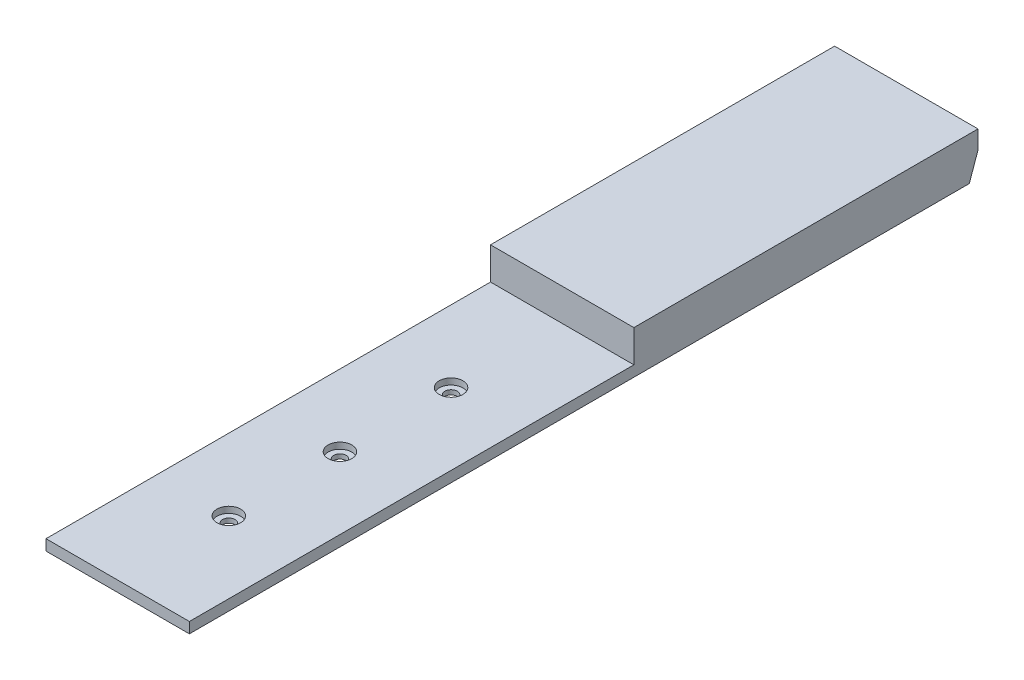
ISO-10303-21;
HEADER;
FILE_DESCRIPTION(('STEP AP214'),'2;1');
FILE_NAME('part.step','',(''),(''),'','','');
FILE_SCHEMA(('AUTOMOTIVE_DESIGN { 1 0 10303 214 1 1 1 1 }'));
ENDSEC;
DATA;
#1=APPLICATION_CONTEXT('core data for automotive mechanical design processes');
#2=APPLICATION_PROTOCOL_DEFINITION('international standard','automotive_design',2000,#1);
#3=PRODUCT_CONTEXT('',#1,'mechanical');
#4=PRODUCT('Part','Part','',(#3));
#5=PRODUCT_RELATED_PRODUCT_CATEGORY('part','',(#4));
#6=PRODUCT_DEFINITION_FORMATION('','',#4);
#7=PRODUCT_DEFINITION_CONTEXT('part definition',#1,'design');
#8=PRODUCT_DEFINITION('design','',#6,#7);
#9=PRODUCT_DEFINITION_SHAPE('','',#8);
#10=(LENGTH_UNIT() NAMED_UNIT(*) SI_UNIT(.MILLI.,.METRE.));
#11=(NAMED_UNIT(*) PLANE_ANGLE_UNIT() SI_UNIT($,.RADIAN.));
#12=(NAMED_UNIT(*) SI_UNIT($,.STERADIAN.) SOLID_ANGLE_UNIT());
#13=UNCERTAINTY_MEASURE_WITH_UNIT(LENGTH_MEASURE(1.E-05),#10,'distance_accuracy_value','');
#14=(GEOMETRIC_REPRESENTATION_CONTEXT(3) GLOBAL_UNCERTAINTY_ASSIGNED_CONTEXT((#13)) GLOBAL_UNIT_ASSIGNED_CONTEXT((#10,
#11,#12)) REPRESENTATION_CONTEXT('',''));
#15=CARTESIAN_POINT('',(0.,0.,0.));
#16=DIRECTION('',(0.,0.,1.));
#17=DIRECTION('',(1.,0.,0.));
#18=AXIS2_PLACEMENT_3D('',#15,#16,#17);
#19=CARTESIAN_POINT('',(-31.75,0.,349.25));
#20=DIRECTION('',(1.,0.,0.));
#21=DIRECTION('',(0.,0.,-1.));
#22=AXIS2_PLACEMENT_3D('',#19,#20,#21);
#23=PLANE('',#22);
#24=DIRECTION('',(0.,-1.,0.));
#25=VECTOR('',#24,1.);
#26=CARTESIAN_POINT('',(-31.75,0.,0.));
#27=LINE('',#26,#25);
#28=CARTESIAN_POINT('',(-31.75,19.05,0.));
#29=VERTEX_POINT('',#28);
#30=CARTESIAN_POINT('',(-31.75,10.9241136241484,0.));
#31=VERTEX_POINT('',#30);
#32=EDGE_CURVE('E107',#29,#31,#27,.T.);
#33=ORIENTED_EDGE('',*,*,#32,.T.);
#34=DIRECTION('',(0.,-0.942781878984078,0.333410150804158));
#35=VECTOR('',#34,1.);
#36=CARTESIAN_POINT('',(-31.75,0.,3.86325877917154));
#37=LINE('',#36,#35);
#38=CARTESIAN_POINT('',(-31.75,0.,3.86325877917154));
#39=VERTEX_POINT('',#38);
#40=EDGE_CURVE('E50',#31,#39,#37,.T.);
#41=ORIENTED_EDGE('',*,*,#40,.T.);
#42=DIRECTION('',(0.,0.,-1.));
#43=VECTOR('',#42,1.);
#44=CARTESIAN_POINT('',(-31.75,0.,349.25));
#45=LINE('',#44,#43);
#46=CARTESIAN_POINT('',(-31.75,0.,349.25));
#47=VERTEX_POINT('',#46);
#48=EDGE_CURVE('E11',#47,#39,#45,.T.);
#49=ORIENTED_EDGE('',*,*,#48,.F.);
#50=DIRECTION('',(0.,-1.,0.));
#51=VECTOR('',#50,1.);
#52=CARTESIAN_POINT('',(-31.75,0.,349.25));
#53=LINE('',#52,#51);
#54=CARTESIAN_POINT('',(-31.75,4.76249999999996,349.25));
#55=VERTEX_POINT('',#54);
#56=EDGE_CURVE('E116',#55,#47,#53,.T.);
#57=ORIENTED_EDGE('',*,*,#56,.F.);
#58=DIRECTION('',(0.,0.,-1.));
#59=VECTOR('',#58,1.);
#60=CARTESIAN_POINT('',(-31.75,4.76249999999997,349.25));
#61=LINE('',#60,#59);
#62=CARTESIAN_POINT('',(-31.75,4.76249999999997,152.4));
#63=VERTEX_POINT('',#62);
#64=EDGE_CURVE('E58',#55,#63,#61,.T.);
#65=ORIENTED_EDGE('',*,*,#64,.T.);
#66=DIRECTION('',(0.,1.,0.));
#67=VECTOR('',#66,1.);
#68=CARTESIAN_POINT('',(-31.75,19.05,152.4));
#69=LINE('',#68,#67);
#70=CARTESIAN_POINT('',(-31.75,19.05,152.4));
#71=VERTEX_POINT('',#70);
#72=EDGE_CURVE('E142',#63,#71,#69,.T.);
#73=ORIENTED_EDGE('',*,*,#72,.T.);
#74=DIRECTION('',(0.,0.,-1.));
#75=VECTOR('',#74,1.);
#76=CARTESIAN_POINT('',(-31.75,19.05,349.25));
#77=LINE('',#76,#75);
#78=EDGE_CURVE('E118',#71,#29,#77,.T.);
#79=ORIENTED_EDGE('',*,*,#78,.T.);
#80=EDGE_LOOP('',(#33,#41,#49,#57,#65,#73,#79));
#81=FACE_BOUND('',#80,.T.);
#82=ADVANCED_FACE('F36',(#81),#23,.F.);
#83=CARTESIAN_POINT('',(-31.75,0.,349.25));
#84=DIRECTION('',(0.,1.,0.));
#85=DIRECTION('',(-1.,0.,0.));
#86=AXIS2_PLACEMENT_3D('',#83,#84,#85);
#87=PLANE('',#86);
#88=CARTESIAN_POINT('',(0.,0.,201.6125));
#89=DIRECTION('',(0.,1.,0.));
#90=DIRECTION('',(0.,0.,1.));
#91=AXIS2_PLACEMENT_3D('',#88,#89,#90);
#92=CIRCLE('',#91,2.75);
#93=CARTESIAN_POINT('',(0.,0.,204.3625));
#94=VERTEX_POINT('',#93);
#95=EDGE_CURVE('E376',#94,#94,#92,.T.);
#96=ORIENTED_EDGE('',*,*,#95,.T.);
#97=EDGE_LOOP('',(#96));
#98=FACE_BOUND('',#97,.T.);
#99=CARTESIAN_POINT('',(0.,0.,250.825));
#100=DIRECTION('',(0.,1.,0.));
#101=DIRECTION('',(0.,0.,1.));
#102=AXIS2_PLACEMENT_3D('',#99,#100,#101);
#103=CIRCLE('',#102,2.75);
#104=CARTESIAN_POINT('',(0.,0.,253.575));
#105=VERTEX_POINT('',#104);
#106=EDGE_CURVE('E387',#105,#105,#103,.T.);
#107=ORIENTED_EDGE('',*,*,#106,.T.);
#108=EDGE_LOOP('',(#107));
#109=FACE_BOUND('',#108,.T.);
#110=CARTESIAN_POINT('',(0.,0.,300.0375));
#111=DIRECTION('',(0.,1.,0.));
#112=DIRECTION('',(0.,0.,1.));
#113=AXIS2_PLACEMENT_3D('',#110,#111,#112);
#114=CIRCLE('',#113,2.75);
#115=CARTESIAN_POINT('',(0.,0.,302.7875));
#116=VERTEX_POINT('',#115);
#117=EDGE_CURVE('E399',#116,#116,#114,.T.);
#118=ORIENTED_EDGE('',*,*,#117,.T.);
#119=EDGE_LOOP('',(#118));
#120=FACE_BOUND('',#119,.T.);
#121=ORIENTED_EDGE('',*,*,#48,.T.);
#122=DIRECTION('',(1.,0.,0.));
#123=VECTOR('',#122,1.);
#124=CARTESIAN_POINT('',(-31.75,0.,3.86325877917154));
#125=LINE('',#124,#123);
#126=CARTESIAN_POINT('',(31.75,0.,3.86325877917154));
#127=VERTEX_POINT('',#126);
#128=EDGE_CURVE('E92',#39,#127,#125,.T.);
#129=ORIENTED_EDGE('',*,*,#128,.T.);
#130=DIRECTION('',(0.,0.,-1.));
#131=VECTOR('',#130,1.);
#132=CARTESIAN_POINT('',(31.75,0.,349.25));
#133=LINE('',#132,#131);
#134=CARTESIAN_POINT('',(31.75,0.,349.25));
#135=VERTEX_POINT('',#134);
#136=EDGE_CURVE('E43',#135,#127,#133,.T.);
#137=ORIENTED_EDGE('',*,*,#136,.F.);
#138=DIRECTION('',(1.,0.,0.));
#139=VECTOR('',#138,1.);
#140=CARTESIAN_POINT('',(-31.75,0.,349.25));
#141=LINE('',#140,#139);
#142=EDGE_CURVE('E111',#47,#135,#141,.T.);
#143=ORIENTED_EDGE('',*,*,#142,.F.);
#144=EDGE_LOOP('',(#121,#129,#137,#143));
#145=FACE_BOUND('',#144,.T.);
#146=ADVANCED_FACE('F110',(#98,#109,#120,#145),#87,.F.);
#147=CARTESIAN_POINT('',(31.75,0.,349.25));
#148=DIRECTION('',(-1.,0.,0.));
#149=DIRECTION('',(0.,-1.,0.));
#150=AXIS2_PLACEMENT_3D('',#147,#148,#149);
#151=PLANE('',#150);
#152=ORIENTED_EDGE('',*,*,#136,.T.);
#153=DIRECTION('',(0.,-0.942781878984078,0.333410150804158));
#154=VECTOR('',#153,1.);
#155=CARTESIAN_POINT('',(31.75,0.,3.86325877917154));
#156=LINE('',#155,#154);
#157=CARTESIAN_POINT('',(31.75,10.9241136241484,0.));
#158=VERTEX_POINT('',#157);
#159=EDGE_CURVE('E95',#158,#127,#156,.T.);
#160=ORIENTED_EDGE('',*,*,#159,.F.);
#161=DIRECTION('',(0.,1.,0.));
#162=VECTOR('',#161,1.);
#163=CARTESIAN_POINT('',(31.75,0.,0.));
#164=LINE('',#163,#162);
#165=CARTESIAN_POINT('',(31.75,19.05,0.));
#166=VERTEX_POINT('',#165);
#167=EDGE_CURVE('E125',#158,#166,#164,.T.);
#168=ORIENTED_EDGE('',*,*,#167,.T.);
#169=DIRECTION('',(0.,0.,-1.));
#170=VECTOR('',#169,1.);
#171=CARTESIAN_POINT('',(31.75,19.05,349.25));
#172=LINE('',#171,#170);
#173=CARTESIAN_POINT('',(31.75,19.05,152.4));
#174=VERTEX_POINT('',#173);
#175=EDGE_CURVE('E131',#174,#166,#172,.T.);
#176=ORIENTED_EDGE('',*,*,#175,.F.);
#177=DIRECTION('',(0.,1.,0.));
#178=VECTOR('',#177,1.);
#179=CARTESIAN_POINT('',(31.75,19.05,152.4));
#180=LINE('',#179,#178);
#181=CARTESIAN_POINT('',(31.75,4.76250000000001,152.4));
#182=VERTEX_POINT('',#181);
#183=EDGE_CURVE('E146',#182,#174,#180,.T.);
#184=ORIENTED_EDGE('',*,*,#183,.F.);
#185=DIRECTION('',(0.,0.,-1.));
#186=VECTOR('',#185,1.);
#187=CARTESIAN_POINT('',(31.75,4.76250000000001,349.25));
#188=LINE('',#187,#186);
#189=CARTESIAN_POINT('',(31.75,4.76250000000001,349.25));
#190=VERTEX_POINT('',#189);
#191=EDGE_CURVE('E99',#190,#182,#188,.T.);
#192=ORIENTED_EDGE('',*,*,#191,.F.);
#193=DIRECTION('',(0.,1.,0.));
#194=VECTOR('',#193,1.);
#195=CARTESIAN_POINT('',(31.75,0.,349.25));
#196=LINE('',#195,#194);
#197=EDGE_CURVE('E115',#135,#190,#196,.T.);
#198=ORIENTED_EDGE('',*,*,#197,.F.);
#199=EDGE_LOOP('',(#152,#160,#168,#176,#184,#192,#198));
#200=FACE_BOUND('',#199,.T.);
#201=ADVANCED_FACE('F134',(#200),#151,.F.);
#202=CARTESIAN_POINT('',(-31.75,19.05,349.25));
#203=DIRECTION('',(0.,-1.,0.));
#204=DIRECTION('',(1.,0.,0.));
#205=AXIS2_PLACEMENT_3D('',#202,#203,#204);
#206=PLANE('',#205);
#207=ORIENTED_EDGE('',*,*,#78,.F.);
#208=DIRECTION('',(1.,0.,0.));
#209=VECTOR('',#208,1.);
#210=CARTESIAN_POINT('',(-31.75,19.05,152.4));
#211=LINE('',#210,#209);
#212=EDGE_CURVE('E126',#71,#174,#211,.T.);
#213=ORIENTED_EDGE('',*,*,#212,.T.);
#214=ORIENTED_EDGE('',*,*,#175,.T.);
#215=DIRECTION('',(-1.,0.,0.));
#216=VECTOR('',#215,1.);
#217=CARTESIAN_POINT('',(-31.75,19.05,0.));
#218=LINE('',#217,#216);
#219=EDGE_CURVE('E120',#166,#29,#218,.T.);
#220=ORIENTED_EDGE('',*,*,#219,.T.);
#221=EDGE_LOOP('',(#207,#213,#214,#220));
#222=FACE_BOUND('',#221,.T.);
#223=ADVANCED_FACE('F161',(#222),#206,.F.);
#224=CARTESIAN_POINT('',(0.,0.,349.25));
#225=DIRECTION('',(0.,0.,-1.));
#226=DIRECTION('',(-1.,0.,0.));
#227=AXIS2_PLACEMENT_3D('',#224,#225,#226);
#228=PLANE('',#227);
#229=ORIENTED_EDGE('',*,*,#197,.T.);
#230=DIRECTION('',(1.,0.,0.));
#231=VECTOR('',#230,1.);
#232=CARTESIAN_POINT('',(-31.75,4.76249999999997,349.25));
#233=LINE('',#232,#231);
#234=EDGE_CURVE('E140',#55,#190,#233,.T.);
#235=ORIENTED_EDGE('',*,*,#234,.F.);
#236=ORIENTED_EDGE('',*,*,#56,.T.);
#237=ORIENTED_EDGE('',*,*,#142,.T.);
#238=EDGE_LOOP('',(#229,#235,#236,#237));
#239=FACE_BOUND('',#238,.T.);
#240=ADVANCED_FACE('F139',(#239),#228,.F.);
#241=CARTESIAN_POINT('',(0.,0.,0.));
#242=DIRECTION('',(0.,0.,-1.));
#243=DIRECTION('',(-1.,0.,0.));
#244=AXIS2_PLACEMENT_3D('',#241,#242,#243);
#245=PLANE('',#244);
#246=DIRECTION('',(1.,0.,0.));
#247=VECTOR('',#246,1.);
#248=CARTESIAN_POINT('',(-31.75,10.9241136241484,0.));
#249=LINE('',#248,#247);
#250=EDGE_CURVE('E100',#31,#158,#249,.T.);
#251=ORIENTED_EDGE('',*,*,#250,.F.);
#252=ORIENTED_EDGE('',*,*,#32,.F.);
#253=ORIENTED_EDGE('',*,*,#219,.F.);
#254=ORIENTED_EDGE('',*,*,#167,.F.);
#255=EDGE_LOOP('',(#251,#252,#253,#254));
#256=FACE_BOUND('',#255,.T.);
#257=ADVANCED_FACE('F163',(#256),#245,.T.);
#258=CARTESIAN_POINT('',(-31.75,19.05,152.4));
#259=DIRECTION('',(0.,0.,-1.));
#260=DIRECTION('',(-1.,0.,0.));
#261=AXIS2_PLACEMENT_3D('',#258,#259,#260);
#262=PLANE('',#261);
#263=ORIENTED_EDGE('',*,*,#183,.T.);
#264=ORIENTED_EDGE('',*,*,#212,.F.);
#265=ORIENTED_EDGE('',*,*,#72,.F.);
#266=DIRECTION('',(1.,0.,0.));
#267=VECTOR('',#266,1.);
#268=CARTESIAN_POINT('',(-31.75,4.76249999999997,152.4));
#269=LINE('',#268,#267);
#270=EDGE_CURVE('E141',#63,#182,#269,.T.);
#271=ORIENTED_EDGE('',*,*,#270,.T.);
#272=EDGE_LOOP('',(#263,#264,#265,#271));
#273=FACE_BOUND('',#272,.T.);
#274=ADVANCED_FACE('F156',(#273),#262,.F.);
#275=CARTESIAN_POINT('',(-31.75,4.76249999999997,349.25));
#276=DIRECTION('',(0.,-1.,0.));
#277=DIRECTION('',(1.,0.,0.));
#278=AXIS2_PLACEMENT_3D('',#275,#276,#277);
#279=PLANE('',#278);
#280=CARTESIAN_POINT('',(0.,4.76249999999999,201.6125));
#281=DIRECTION('',(0.,1.,0.));
#282=DIRECTION('',(0.,0.,1.));
#283=AXIS2_PLACEMENT_3D('',#280,#281,#282);
#284=CIRCLE('',#283,5.24999999999999);
#285=CARTESIAN_POINT('',(0.,4.76249999999999,206.8625));
#286=VERTEX_POINT('',#285);
#287=EDGE_CURVE('E369',#286,#286,#284,.T.);
#288=ORIENTED_EDGE('',*,*,#287,.F.);
#289=EDGE_LOOP('',(#288));
#290=FACE_BOUND('',#289,.T.);
#291=CARTESIAN_POINT('',(0.,4.76249999999999,250.825));
#292=DIRECTION('',(0.,1.,0.));
#293=DIRECTION('',(0.,0.,1.));
#294=AXIS2_PLACEMENT_3D('',#291,#292,#293);
#295=CIRCLE('',#294,5.24999999999999);
#296=CARTESIAN_POINT('',(0.,4.76249999999999,256.075));
#297=VERTEX_POINT('',#296);
#298=EDGE_CURVE('E378',#297,#297,#295,.T.);
#299=ORIENTED_EDGE('',*,*,#298,.F.);
#300=EDGE_LOOP('',(#299));
#301=FACE_BOUND('',#300,.T.);
#302=CARTESIAN_POINT('',(0.,4.76249999999999,300.0375));
#303=DIRECTION('',(0.,1.,0.));
#304=DIRECTION('',(0.,0.,1.));
#305=AXIS2_PLACEMENT_3D('',#302,#303,#304);
#306=CIRCLE('',#305,5.24999999999999);
#307=CARTESIAN_POINT('',(0.,4.76249999999999,305.2875));
#308=VERTEX_POINT('',#307);
#309=EDGE_CURVE('E390',#308,#308,#306,.T.);
#310=ORIENTED_EDGE('',*,*,#309,.F.);
#311=EDGE_LOOP('',(#310));
#312=FACE_BOUND('',#311,.T.);
#313=ORIENTED_EDGE('',*,*,#191,.T.);
#314=ORIENTED_EDGE('',*,*,#270,.F.);
#315=ORIENTED_EDGE('',*,*,#64,.F.);
#316=ORIENTED_EDGE('',*,*,#234,.T.);
#317=EDGE_LOOP('',(#313,#314,#315,#316));
#318=FACE_BOUND('',#317,.T.);
#319=ADVANCED_FACE('F157',(#290,#301,#312,#318),#279,.F.);
#320=CARTESIAN_POINT('',(-31.75,0.,3.86325877917154));
#321=DIRECTION('',(0.,0.333410150804158,0.942781878984078));
#322=DIRECTION('',(0.,-0.942781878984078,0.333410150804158));
#323=AXIS2_PLACEMENT_3D('',#320,#321,#322);
#324=PLANE('',#323);
#325=ORIENTED_EDGE('',*,*,#159,.T.);
#326=ORIENTED_EDGE('',*,*,#128,.F.);
#327=ORIENTED_EDGE('',*,*,#40,.F.);
#328=ORIENTED_EDGE('',*,*,#250,.T.);
#329=EDGE_LOOP('',(#325,#326,#327,#328));
#330=FACE_BOUND('',#329,.T.);
#331=ADVANCED_FACE('F93',(#330),#324,.F.);
#332=CARTESIAN_POINT('',(0.,4.76249999999999,300.0375));
#333=DIRECTION('',(0.,1.,0.));
#334=DIRECTION('',(0.,0.,1.));
#335=AXIS2_PLACEMENT_3D('',#332,#333,#334);
#336=CYLINDRICAL_SURFACE('',#335,2.75);
#337=ORIENTED_EDGE('',*,*,#117,.F.);
#338=EDGE_LOOP('',(#337));
#339=FACE_BOUND('',#338,.T.);
#340=CARTESIAN_POINT('',(0.,2.01249999999999,300.0375));
#341=DIRECTION('',(0.,1.,0.));
#342=DIRECTION('',(0.,0.,1.));
#343=AXIS2_PLACEMENT_3D('',#340,#341,#342);
#344=CIRCLE('',#343,2.75);
#345=CARTESIAN_POINT('',(0.,2.01249999999999,302.7875));
#346=VERTEX_POINT('',#345);
#347=EDGE_CURVE('E396',#346,#346,#344,.T.);
#348=ORIENTED_EDGE('',*,*,#347,.T.);
#349=EDGE_LOOP('',(#348));
#350=FACE_BOUND('',#349,.T.);
#351=ADVANCED_FACE('F221',(#339,#350),#336,.F.);
#352=CARTESIAN_POINT('',(2.75,2.01249999999999,300.0375));
#353=DIRECTION('',(0.,-1.,0.));
#354=DIRECTION('',(0.,0.,-1.));
#355=AXIS2_PLACEMENT_3D('',#352,#353,#354);
#356=PLANE('',#355);
#357=ORIENTED_EDGE('',*,*,#347,.F.);
#358=EDGE_LOOP('',(#357));
#359=FACE_BOUND('',#358,.T.);
#360=CARTESIAN_POINT('',(0.,2.01249999999999,300.0375));
#361=DIRECTION('',(0.,1.,0.));
#362=DIRECTION('',(0.,0.,1.));
#363=AXIS2_PLACEMENT_3D('',#360,#361,#362);
#364=CIRCLE('',#363,5.25);
#365=CARTESIAN_POINT('',(0.,2.01249999999999,305.2875));
#366=VERTEX_POINT('',#365);
#367=EDGE_CURVE('E393',#366,#366,#364,.T.);
#368=ORIENTED_EDGE('',*,*,#367,.T.);
#369=EDGE_LOOP('',(#368));
#370=FACE_BOUND('',#369,.T.);
#371=ADVANCED_FACE('F226',(#359,#370),#356,.F.);
#372=CARTESIAN_POINT('',(0.,4.76249999999999,300.0375));
#373=DIRECTION('',(0.,1.,0.));
#374=DIRECTION('',(0.,0.,1.));
#375=AXIS2_PLACEMENT_3D('',#372,#373,#374);
#376=CYLINDRICAL_SURFACE('',#375,5.25);
#377=ORIENTED_EDGE('',*,*,#367,.F.);
#378=EDGE_LOOP('',(#377));
#379=FACE_BOUND('',#378,.T.);
#380=ORIENTED_EDGE('',*,*,#309,.T.);
#381=EDGE_LOOP('',(#380));
#382=FACE_BOUND('',#381,.T.);
#383=ADVANCED_FACE('F234',(#379,#382),#376,.F.);
#384=CARTESIAN_POINT('',(0.,4.76249999999999,250.825));
#385=DIRECTION('',(0.,1.,0.));
#386=DIRECTION('',(0.,0.,1.));
#387=AXIS2_PLACEMENT_3D('',#384,#385,#386);
#388=CYLINDRICAL_SURFACE('',#387,2.75);
#389=ORIENTED_EDGE('',*,*,#106,.F.);
#390=EDGE_LOOP('',(#389));
#391=FACE_BOUND('',#390,.T.);
#392=CARTESIAN_POINT('',(0.,2.01249999999999,250.825));
#393=DIRECTION('',(0.,1.,0.));
#394=DIRECTION('',(0.,0.,1.));
#395=AXIS2_PLACEMENT_3D('',#392,#393,#394);
#396=CIRCLE('',#395,2.75);
#397=CARTESIAN_POINT('',(0.,2.01249999999999,253.575));
#398=VERTEX_POINT('',#397);
#399=EDGE_CURVE('E384',#398,#398,#396,.T.);
#400=ORIENTED_EDGE('',*,*,#399,.T.);
#401=EDGE_LOOP('',(#400));
#402=FACE_BOUND('',#401,.T.);
#403=ADVANCED_FACE('F242',(#391,#402),#388,.F.);
#404=CARTESIAN_POINT('',(2.75,2.01249999999999,250.825));
#405=DIRECTION('',(0.,-1.,0.));
#406=DIRECTION('',(0.,0.,-1.));
#407=AXIS2_PLACEMENT_3D('',#404,#405,#406);
#408=PLANE('',#407);
#409=ORIENTED_EDGE('',*,*,#399,.F.);
#410=EDGE_LOOP('',(#409));
#411=FACE_BOUND('',#410,.T.);
#412=CARTESIAN_POINT('',(0.,2.01249999999999,250.825));
#413=DIRECTION('',(0.,1.,0.));
#414=DIRECTION('',(0.,0.,1.));
#415=AXIS2_PLACEMENT_3D('',#412,#413,#414);
#416=CIRCLE('',#415,5.25);
#417=CARTESIAN_POINT('',(0.,2.01249999999999,256.075));
#418=VERTEX_POINT('',#417);
#419=EDGE_CURVE('E381',#418,#418,#416,.T.);
#420=ORIENTED_EDGE('',*,*,#419,.T.);
#421=EDGE_LOOP('',(#420));
#422=FACE_BOUND('',#421,.T.);
#423=ADVANCED_FACE('F250',(#411,#422),#408,.F.);
#424=CARTESIAN_POINT('',(0.,4.76249999999999,250.825));
#425=DIRECTION('',(0.,1.,0.));
#426=DIRECTION('',(0.,0.,1.));
#427=AXIS2_PLACEMENT_3D('',#424,#425,#426);
#428=CYLINDRICAL_SURFACE('',#427,5.25);
#429=ORIENTED_EDGE('',*,*,#419,.F.);
#430=EDGE_LOOP('',(#429));
#431=FACE_BOUND('',#430,.T.);
#432=ORIENTED_EDGE('',*,*,#298,.T.);
#433=EDGE_LOOP('',(#432));
#434=FACE_BOUND('',#433,.T.);
#435=ADVANCED_FACE('F258',(#431,#434),#428,.F.);
#436=CARTESIAN_POINT('',(0.,4.76249999999999,201.6125));
#437=DIRECTION('',(0.,1.,0.));
#438=DIRECTION('',(0.,0.,1.));
#439=AXIS2_PLACEMENT_3D('',#436,#437,#438);
#440=CYLINDRICAL_SURFACE('',#439,2.75);
#441=ORIENTED_EDGE('',*,*,#95,.F.);
#442=EDGE_LOOP('',(#441));
#443=FACE_BOUND('',#442,.T.);
#444=CARTESIAN_POINT('',(0.,2.01249999999999,201.6125));
#445=DIRECTION('',(0.,1.,0.));
#446=DIRECTION('',(0.,0.,1.));
#447=AXIS2_PLACEMENT_3D('',#444,#445,#446);
#448=CIRCLE('',#447,2.75);
#449=CARTESIAN_POINT('',(0.,2.01249999999999,204.3625));
#450=VERTEX_POINT('',#449);
#451=EDGE_CURVE('E371',#450,#450,#448,.T.);
#452=ORIENTED_EDGE('',*,*,#451,.T.);
#453=EDGE_LOOP('',(#452));
#454=FACE_BOUND('',#453,.T.);
#455=ADVANCED_FACE('F266',(#443,#454),#440,.F.);
#456=CARTESIAN_POINT('',(2.75,2.01249999999999,201.6125));
#457=DIRECTION('',(0.,-1.,0.));
#458=DIRECTION('',(0.,0.,-1.));
#459=AXIS2_PLACEMENT_3D('',#456,#457,#458);
#460=PLANE('',#459);
#461=ORIENTED_EDGE('',*,*,#451,.F.);
#462=EDGE_LOOP('',(#461));
#463=FACE_BOUND('',#462,.T.);
#464=CARTESIAN_POINT('',(0.,2.01249999999999,201.6125));
#465=DIRECTION('',(0.,1.,0.));
#466=DIRECTION('',(0.,0.,1.));
#467=AXIS2_PLACEMENT_3D('',#464,#465,#466);
#468=CIRCLE('',#467,5.25);
#469=CARTESIAN_POINT('',(0.,2.01249999999999,206.8625));
#470=VERTEX_POINT('',#469);
#471=EDGE_CURVE('E366',#470,#470,#468,.T.);
#472=ORIENTED_EDGE('',*,*,#471,.T.);
#473=EDGE_LOOP('',(#472));
#474=FACE_BOUND('',#473,.T.);
#475=ADVANCED_FACE('F274',(#463,#474),#460,.F.);
#476=CARTESIAN_POINT('',(0.,4.76249999999999,201.6125));
#477=DIRECTION('',(0.,1.,0.));
#478=DIRECTION('',(0.,0.,1.));
#479=AXIS2_PLACEMENT_3D('',#476,#477,#478);
#480=CYLINDRICAL_SURFACE('',#479,5.25);
#481=ORIENTED_EDGE('',*,*,#471,.F.);
#482=EDGE_LOOP('',(#481));
#483=FACE_BOUND('',#482,.T.);
#484=ORIENTED_EDGE('',*,*,#287,.T.);
#485=EDGE_LOOP('',(#484));
#486=FACE_BOUND('',#485,.T.);
#487=ADVANCED_FACE('F282',(#483,#486),#480,.F.);
#488=CLOSED_SHELL('',(#82,#146,#201,#223,#240,#257,#274,#319,#331,#351,#371,#383,#403,#423,#435,
#455,#475,#487));
#489=MANIFOLD_SOLID_BREP('B2',#488);
#490=ADVANCED_BREP_SHAPE_REPRESENTATION('',(#18,#489),#14);
#491=SHAPE_DEFINITION_REPRESENTATION(#9,#490);
ENDSEC;
END-ISO-10303-21;
